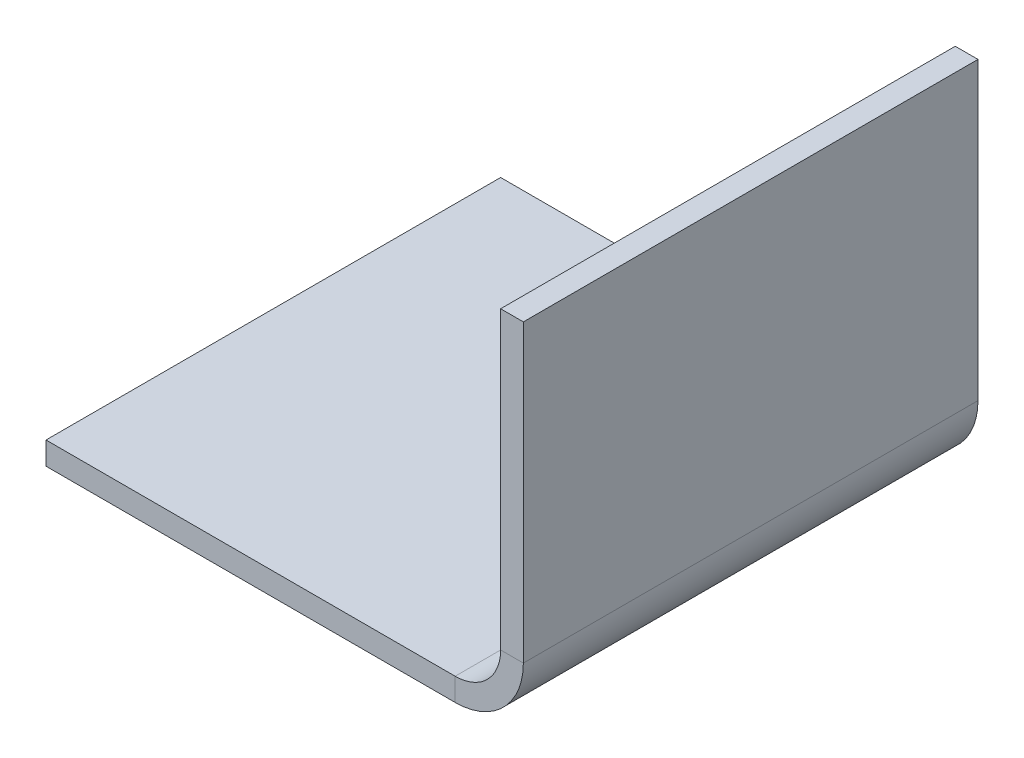
ISO-10303-21;
HEADER;
FILE_DESCRIPTION(('STEP AP214'),'2;1');
FILE_NAME('part.step','',(''),(''),'','','');
FILE_SCHEMA(('AUTOMOTIVE_DESIGN { 1 0 10303 214 1 1 1 1 }'));
ENDSEC;
DATA;
#1=APPLICATION_CONTEXT('core data for automotive mechanical design processes');
#2=APPLICATION_PROTOCOL_DEFINITION('international standard','automotive_design',2000,#1);
#3=PRODUCT_CONTEXT('',#1,'mechanical');
#4=PRODUCT('Part','Part','',(#3));
#5=PRODUCT_RELATED_PRODUCT_CATEGORY('part','',(#4));
#6=PRODUCT_DEFINITION_FORMATION('','',#4);
#7=PRODUCT_DEFINITION_CONTEXT('part definition',#1,'design');
#8=PRODUCT_DEFINITION('design','',#6,#7);
#9=PRODUCT_DEFINITION_SHAPE('','',#8);
#10=(LENGTH_UNIT() NAMED_UNIT(*) SI_UNIT(.MILLI.,.METRE.));
#11=(NAMED_UNIT(*) PLANE_ANGLE_UNIT() SI_UNIT($,.RADIAN.));
#12=(NAMED_UNIT(*) SI_UNIT($,.STERADIAN.) SOLID_ANGLE_UNIT());
#13=UNCERTAINTY_MEASURE_WITH_UNIT(LENGTH_MEASURE(1.E-05),#10,'distance_accuracy_value','');
#14=(GEOMETRIC_REPRESENTATION_CONTEXT(3) GLOBAL_UNCERTAINTY_ASSIGNED_CONTEXT((#13)) GLOBAL_UNIT_ASSIGNED_CONTEXT((#10,
#11,#12)) REPRESENTATION_CONTEXT('',''));
#15=CARTESIAN_POINT('',(0.,0.,0.));
#16=DIRECTION('',(0.,0.,1.));
#17=DIRECTION('',(1.,0.,0.));
#18=AXIS2_PLACEMENT_3D('',#15,#16,#17);
#19=CARTESIAN_POINT('',(20.,2.,20.));
#20=DIRECTION('',(0.,0.,1.));
#21=DIRECTION('',(1.,0.,0.));
#22=AXIS2_PLACEMENT_3D('',#19,#20,#21);
#23=PLANE('',#22);
#24=DIRECTION('',(1.,0.,0.));
#25=VECTOR('',#24,1.);
#26=CARTESIAN_POINT('',(20.,2.,20.));
#27=LINE('',#26,#25);
#28=CARTESIAN_POINT('',(20.,2.,20.));
#29=VERTEX_POINT('',#28);
#30=CARTESIAN_POINT('',(21.,2.,20.));
#31=VERTEX_POINT('',#30);
#32=EDGE_CURVE('E11',#29,#31,#27,.T.);
#33=ORIENTED_EDGE('',*,*,#32,.F.);
#34=CARTESIAN_POINT('',(18.,2.,20.));
#35=DIRECTION('',(0.,0.,-1.));
#36=DIRECTION('',(-1.,0.,0.));
#37=AXIS2_PLACEMENT_3D('',#34,#35,#36);
#38=CIRCLE('',#37,2.);
#39=CARTESIAN_POINT('',(18.,0.,20.));
#40=VERTEX_POINT('',#39);
#41=EDGE_CURVE('E139',#40,#29,#38,.F.);
#42=ORIENTED_EDGE('',*,*,#41,.F.);
#43=DIRECTION('',(0.,1.,0.));
#44=VECTOR('',#43,1.);
#45=CARTESIAN_POINT('',(18.,-1.,20.));
#46=LINE('',#45,#44);
#47=CARTESIAN_POINT('',(18.,-1.,20.));
#48=VERTEX_POINT('',#47);
#49=EDGE_CURVE('E47',#48,#40,#46,.T.);
#50=ORIENTED_EDGE('',*,*,#49,.F.);
#51=CARTESIAN_POINT('',(18.,2.,20.));
#52=DIRECTION('',(0.,0.,1.));
#53=DIRECTION('',(1.,0.,0.));
#54=AXIS2_PLACEMENT_3D('',#51,#52,#53);
#55=CIRCLE('',#54,3.);
#56=EDGE_CURVE('E133',#48,#31,#55,.T.);
#57=ORIENTED_EDGE('',*,*,#56,.T.);
#58=EDGE_LOOP('',(#33,#42,#50,#57));
#59=FACE_BOUND('',#58,.T.);
#60=ADVANCED_FACE('F41',(#59),#23,.T.);
#61=CARTESIAN_POINT('',(18.,-1.,20.));
#62=DIRECTION('',(0.,0.,1.));
#63=DIRECTION('',(1.,0.,0.));
#64=AXIS2_PLACEMENT_3D('',#61,#62,#63);
#65=PLANE('',#64);
#66=DIRECTION('',(0.,1.,0.));
#67=VECTOR('',#66,1.);
#68=CARTESIAN_POINT('',(20.,0.,20.));
#69=LINE('',#68,#67);
#70=CARTESIAN_POINT('',(20.,15.,20.));
#71=VERTEX_POINT('',#70);
#72=EDGE_CURVE('E189',#29,#71,#69,.T.);
#73=ORIENTED_EDGE('',*,*,#72,.F.);
#74=ORIENTED_EDGE('',*,*,#32,.T.);
#75=DIRECTION('',(0.,1.,0.));
#76=VECTOR('',#75,1.);
#77=CARTESIAN_POINT('',(21.,0.,20.));
#78=LINE('',#77,#76);
#79=CARTESIAN_POINT('',(21.,15.,20.));
#80=VERTEX_POINT('',#79);
#81=EDGE_CURVE('E100',#31,#80,#78,.T.);
#82=ORIENTED_EDGE('',*,*,#81,.T.);
#83=DIRECTION('',(1.,0.,0.));
#84=VECTOR('',#83,1.);
#85=CARTESIAN_POINT('',(20.,15.,20.));
#86=LINE('',#85,#84);
#87=EDGE_CURVE('E341',#71,#80,#86,.T.);
#88=ORIENTED_EDGE('',*,*,#87,.F.);
#89=EDGE_LOOP('',(#73,#74,#82,#88));
#90=FACE_BOUND('',#89,.T.);
#91=ADVANCED_FACE('F193',(#90),#65,.T.);
#92=CARTESIAN_POINT('',(18.,0.,0.));
#93=DIRECTION('',(0.,0.,-1.));
#94=DIRECTION('',(-1.,0.,0.));
#95=AXIS2_PLACEMENT_3D('',#92,#93,#94);
#96=PLANE('',#95);
#97=DIRECTION('',(0.,-1.,0.));
#98=VECTOR('',#97,1.);
#99=CARTESIAN_POINT('',(18.,0.,0.));
#100=LINE('',#99,#98);
#101=CARTESIAN_POINT('',(18.,0.,0.));
#102=VERTEX_POINT('',#101);
#103=CARTESIAN_POINT('',(18.,-1.,0.));
#104=VERTEX_POINT('',#103);
#105=EDGE_CURVE('E81',#102,#104,#100,.T.);
#106=ORIENTED_EDGE('',*,*,#105,.F.);
#107=CARTESIAN_POINT('',(18.,2.,0.));
#108=DIRECTION('',(0.,0.,-1.));
#109=DIRECTION('',(-1.,0.,0.));
#110=AXIS2_PLACEMENT_3D('',#107,#108,#109);
#111=CIRCLE('',#110,2.);
#112=CARTESIAN_POINT('',(20.,2.,0.));
#113=VERTEX_POINT('',#112);
#114=EDGE_CURVE('E153',#102,#113,#111,.F.);
#115=ORIENTED_EDGE('',*,*,#114,.T.);
#116=DIRECTION('',(-1.,0.,0.));
#117=VECTOR('',#116,1.);
#118=CARTESIAN_POINT('',(21.,2.,0.));
#119=LINE('',#118,#117);
#120=CARTESIAN_POINT('',(21.,2.,0.));
#121=VERTEX_POINT('',#120);
#122=EDGE_CURVE('E93',#121,#113,#119,.T.);
#123=ORIENTED_EDGE('',*,*,#122,.F.);
#124=CARTESIAN_POINT('',(18.,2.,0.));
#125=DIRECTION('',(0.,0.,1.));
#126=DIRECTION('',(1.,0.,0.));
#127=AXIS2_PLACEMENT_3D('',#124,#125,#126);
#128=CIRCLE('',#127,3.);
#129=EDGE_CURVE('E159',#104,#121,#128,.T.);
#130=ORIENTED_EDGE('',*,*,#129,.F.);
#131=EDGE_LOOP('',(#106,#115,#123,#130));
#132=FACE_BOUND('',#131,.T.);
#133=ADVANCED_FACE('F194',(#132),#96,.T.);
#134=CARTESIAN_POINT('',(21.,2.,0.));
#135=DIRECTION('',(0.,0.,-1.));
#136=DIRECTION('',(-1.,0.,0.));
#137=AXIS2_PLACEMENT_3D('',#134,#135,#136);
#138=PLANE('',#137);
#139=DIRECTION('',(1.,0.,0.));
#140=VECTOR('',#139,1.);
#141=CARTESIAN_POINT('',(0.,0.,0.));
#142=LINE('',#141,#140);
#143=CARTESIAN_POINT('',(0.,0.,0.));
#144=VERTEX_POINT('',#143);
#145=EDGE_CURVE('E154',#144,#102,#142,.T.);
#146=ORIENTED_EDGE('',*,*,#145,.T.);
#147=ORIENTED_EDGE('',*,*,#105,.T.);
#148=DIRECTION('',(1.,0.,0.));
#149=VECTOR('',#148,1.);
#150=CARTESIAN_POINT('',(0.,-1.,0.));
#151=LINE('',#150,#149);
#152=CARTESIAN_POINT('',(0.,-1.,0.));
#153=VERTEX_POINT('',#152);
#154=EDGE_CURVE('E158',#153,#104,#151,.T.);
#155=ORIENTED_EDGE('',*,*,#154,.F.);
#156=DIRECTION('',(0.,1.,0.));
#157=VECTOR('',#156,1.);
#158=CARTESIAN_POINT('',(0.,-1.,0.));
#159=LINE('',#158,#157);
#160=EDGE_CURVE('E120',#153,#144,#159,.T.);
#161=ORIENTED_EDGE('',*,*,#160,.T.);
#162=EDGE_LOOP('',(#146,#147,#155,#161));
#163=FACE_BOUND('',#162,.T.);
#164=ADVANCED_FACE('F190',(#163),#138,.T.);
#165=CARTESIAN_POINT('',(21.,0.,20.));
#166=DIRECTION('',(-1.,0.,0.));
#167=DIRECTION('',(0.,0.,1.));
#168=AXIS2_PLACEMENT_3D('',#165,#166,#167);
#169=PLANE('',#168);
#170=DIRECTION('',(0.,1.,0.));
#171=VECTOR('',#170,1.);
#172=CARTESIAN_POINT('',(21.,0.,0.));
#173=LINE('',#172,#171);
#174=CARTESIAN_POINT('',(21.,15.,0.));
#175=VERTEX_POINT('',#174);
#176=EDGE_CURVE('E145',#121,#175,#173,.T.);
#177=ORIENTED_EDGE('',*,*,#176,.T.);
#178=DIRECTION('',(0.,0.,-1.));
#179=VECTOR('',#178,1.);
#180=CARTESIAN_POINT('',(21.,15.,20.));
#181=LINE('',#180,#179);
#182=EDGE_CURVE('E175',#80,#175,#181,.T.);
#183=ORIENTED_EDGE('',*,*,#182,.F.);
#184=ORIENTED_EDGE('',*,*,#81,.F.);
#185=DIRECTION('',(0.,0.,-1.));
#186=VECTOR('',#185,1.);
#187=CARTESIAN_POINT('',(21.,2.,20.));
#188=LINE('',#187,#186);
#189=EDGE_CURVE('E141',#31,#121,#188,.T.);
#190=ORIENTED_EDGE('',*,*,#189,.T.);
#191=EDGE_LOOP('',(#177,#183,#184,#190));
#192=FACE_BOUND('',#191,.T.);
#193=ADVANCED_FACE('F203',(#192),#169,.F.);
#194=CARTESIAN_POINT('',(20.,15.,20.));
#195=DIRECTION('',(0.,1.,0.));
#196=DIRECTION('',(0.,0.,1.));
#197=AXIS2_PLACEMENT_3D('',#194,#195,#196);
#198=PLANE('',#197);
#199=DIRECTION('',(1.,0.,0.));
#200=VECTOR('',#199,1.);
#201=CARTESIAN_POINT('',(20.,15.,0.));
#202=LINE('',#201,#200);
#203=CARTESIAN_POINT('',(20.,15.,0.));
#204=VERTEX_POINT('',#203);
#205=EDGE_CURVE('E150',#204,#175,#202,.T.);
#206=ORIENTED_EDGE('',*,*,#205,.F.);
#207=DIRECTION('',(0.,0.,-1.));
#208=VECTOR('',#207,1.);
#209=CARTESIAN_POINT('',(20.,15.,20.));
#210=LINE('',#209,#208);
#211=EDGE_CURVE('E174',#71,#204,#210,.T.);
#212=ORIENTED_EDGE('',*,*,#211,.F.);
#213=ORIENTED_EDGE('',*,*,#87,.T.);
#214=ORIENTED_EDGE('',*,*,#182,.T.);
#215=EDGE_LOOP('',(#206,#212,#213,#214));
#216=FACE_BOUND('',#215,.T.);
#217=ADVANCED_FACE('F231',(#216),#198,.T.);
#218=CARTESIAN_POINT('',(20.,0.,20.));
#219=DIRECTION('',(-1.,0.,0.));
#220=DIRECTION('',(0.,0.,1.));
#221=AXIS2_PLACEMENT_3D('',#218,#219,#220);
#222=PLANE('',#221);
#223=DIRECTION('',(0.,1.,0.));
#224=VECTOR('',#223,1.);
#225=CARTESIAN_POINT('',(20.,0.,0.));
#226=LINE('',#225,#224);
#227=EDGE_CURVE('E147',#113,#204,#226,.T.);
#228=ORIENTED_EDGE('',*,*,#227,.F.);
#229=DIRECTION('',(0.,0.,-1.));
#230=VECTOR('',#229,1.);
#231=CARTESIAN_POINT('',(20.,2.,20.));
#232=LINE('',#231,#230);
#233=EDGE_CURVE('E166',#29,#113,#232,.T.);
#234=ORIENTED_EDGE('',*,*,#233,.F.);
#235=ORIENTED_EDGE('',*,*,#72,.T.);
#236=ORIENTED_EDGE('',*,*,#211,.T.);
#237=EDGE_LOOP('',(#228,#234,#235,#236));
#238=FACE_BOUND('',#237,.T.);
#239=ADVANCED_FACE('F241',(#238),#222,.T.);
#240=CARTESIAN_POINT('',(18.,2.,20.));
#241=DIRECTION('',(0.,0.,-1.));
#242=DIRECTION('',(-1.,0.,0.));
#243=AXIS2_PLACEMENT_3D('',#240,#241,#242);
#244=CYLINDRICAL_SURFACE('',#243,2.);
#245=ORIENTED_EDGE('',*,*,#114,.F.);
#246=DIRECTION('',(0.,0.,-1.));
#247=VECTOR('',#246,1.);
#248=CARTESIAN_POINT('',(18.,0.,20.));
#249=LINE('',#248,#247);
#250=EDGE_CURVE('E167',#40,#102,#249,.T.);
#251=ORIENTED_EDGE('',*,*,#250,.F.);
#252=ORIENTED_EDGE('',*,*,#41,.T.);
#253=ORIENTED_EDGE('',*,*,#233,.T.);
#254=EDGE_LOOP('',(#245,#251,#252,#253));
#255=FACE_BOUND('',#254,.T.);
#256=ADVANCED_FACE('F181',(#255),#244,.F.);
#257=CARTESIAN_POINT('',(0.,0.,20.));
#258=DIRECTION('',(0.,1.,0.));
#259=DIRECTION('',(0.,0.,1.));
#260=AXIS2_PLACEMENT_3D('',#257,#258,#259);
#261=PLANE('',#260);
#262=ORIENTED_EDGE('',*,*,#145,.F.);
#263=DIRECTION('',(0.,0.,-1.));
#264=VECTOR('',#263,1.);
#265=CARTESIAN_POINT('',(0.,0.,20.));
#266=LINE('',#265,#264);
#267=CARTESIAN_POINT('',(0.,0.,20.));
#268=VERTEX_POINT('',#267);
#269=EDGE_CURVE('E122',#268,#144,#266,.T.);
#270=ORIENTED_EDGE('',*,*,#269,.F.);
#271=DIRECTION('',(1.,0.,0.));
#272=VECTOR('',#271,1.);
#273=CARTESIAN_POINT('',(0.,0.,20.));
#274=LINE('',#273,#272);
#275=EDGE_CURVE('E137',#268,#40,#274,.T.);
#276=ORIENTED_EDGE('',*,*,#275,.T.);
#277=ORIENTED_EDGE('',*,*,#250,.T.);
#278=EDGE_LOOP('',(#262,#270,#276,#277));
#279=FACE_BOUND('',#278,.T.);
#280=ADVANCED_FACE('F187',(#279),#261,.T.);
#281=CARTESIAN_POINT('',(0.,-1.,20.));
#282=DIRECTION('',(-1.,0.,0.));
#283=DIRECTION('',(0.,0.,1.));
#284=AXIS2_PLACEMENT_3D('',#281,#282,#283);
#285=PLANE('',#284);
#286=ORIENTED_EDGE('',*,*,#160,.F.);
#287=DIRECTION('',(0.,0.,-1.));
#288=VECTOR('',#287,1.);
#289=CARTESIAN_POINT('',(0.,-1.,20.));
#290=LINE('',#289,#288);
#291=CARTESIAN_POINT('',(0.,-1.,20.));
#292=VERTEX_POINT('',#291);
#293=EDGE_CURVE('E114',#292,#153,#290,.T.);
#294=ORIENTED_EDGE('',*,*,#293,.F.);
#295=DIRECTION('',(0.,1.,0.));
#296=VECTOR('',#295,1.);
#297=CARTESIAN_POINT('',(0.,-1.,20.));
#298=LINE('',#297,#296);
#299=EDGE_CURVE('E119',#292,#268,#298,.T.);
#300=ORIENTED_EDGE('',*,*,#299,.T.);
#301=ORIENTED_EDGE('',*,*,#269,.T.);
#302=EDGE_LOOP('',(#286,#294,#300,#301));
#303=FACE_BOUND('',#302,.T.);
#304=ADVANCED_FACE('F113',(#303),#285,.T.);
#305=CARTESIAN_POINT('',(0.,-1.,20.));
#306=DIRECTION('',(0.,1.,0.));
#307=DIRECTION('',(0.,0.,1.));
#308=AXIS2_PLACEMENT_3D('',#305,#306,#307);
#309=PLANE('',#308);
#310=ORIENTED_EDGE('',*,*,#154,.T.);
#311=DIRECTION('',(0.,0.,-1.));
#312=VECTOR('',#311,1.);
#313=CARTESIAN_POINT('',(18.,-1.,20.));
#314=LINE('',#313,#312);
#315=EDGE_CURVE('E125',#48,#104,#314,.T.);
#316=ORIENTED_EDGE('',*,*,#315,.F.);
#317=DIRECTION('',(1.,0.,0.));
#318=VECTOR('',#317,1.);
#319=CARTESIAN_POINT('',(0.,-1.,20.));
#320=LINE('',#319,#318);
#321=EDGE_CURVE('E127',#292,#48,#320,.T.);
#322=ORIENTED_EDGE('',*,*,#321,.F.);
#323=ORIENTED_EDGE('',*,*,#293,.T.);
#324=EDGE_LOOP('',(#310,#316,#322,#323));
#325=FACE_BOUND('',#324,.T.);
#326=ADVANCED_FACE('F130',(#325),#309,.F.);
#327=CARTESIAN_POINT('',(18.,2.,20.));
#328=DIRECTION('',(0.,0.,-1.));
#329=DIRECTION('',(-1.,0.,0.));
#330=AXIS2_PLACEMENT_3D('',#327,#328,#329);
#331=CYLINDRICAL_SURFACE('',#330,3.);
#332=ORIENTED_EDGE('',*,*,#129,.T.);
#333=ORIENTED_EDGE('',*,*,#189,.F.);
#334=ORIENTED_EDGE('',*,*,#56,.F.);
#335=ORIENTED_EDGE('',*,*,#315,.T.);
#336=EDGE_LOOP('',(#332,#333,#334,#335));
#337=FACE_BOUND('',#336,.T.);
#338=ADVANCED_FACE('F192',(#337),#331,.T.);
#339=CARTESIAN_POINT('',(18.,2.,20.));
#340=DIRECTION('',(0.,0.,-1.));
#341=DIRECTION('',(-1.,0.,0.));
#342=AXIS2_PLACEMENT_3D('',#339,#340,#341);
#343=PLANE('',#342);
#344=ORIENTED_EDGE('',*,*,#321,.T.);
#345=ORIENTED_EDGE('',*,*,#49,.T.);
#346=ORIENTED_EDGE('',*,*,#275,.F.);
#347=ORIENTED_EDGE('',*,*,#299,.F.);
#348=EDGE_LOOP('',(#344,#345,#346,#347));
#349=FACE_BOUND('',#348,.T.);
#350=ADVANCED_FACE('F135',(#349),#343,.F.);
#351=CARTESIAN_POINT('',(18.,2.,0.));
#352=DIRECTION('',(0.,0.,-1.));
#353=DIRECTION('',(-1.,0.,0.));
#354=AXIS2_PLACEMENT_3D('',#351,#352,#353);
#355=PLANE('',#354);
#356=ORIENTED_EDGE('',*,*,#176,.F.);
#357=ORIENTED_EDGE('',*,*,#122,.T.);
#358=ORIENTED_EDGE('',*,*,#227,.T.);
#359=ORIENTED_EDGE('',*,*,#205,.T.);
#360=EDGE_LOOP('',(#356,#357,#358,#359));
#361=FACE_BOUND('',#360,.T.);
#362=ADVANCED_FACE('F313',(#361),#355,.T.);
#363=CLOSED_SHELL('',(#60,#91,#133,#164,#193,#217,#239,#256,#280,#304,#326,#338,#350,#362));
#364=MANIFOLD_SOLID_BREP('B2',#363);
#365=ADVANCED_BREP_SHAPE_REPRESENTATION('',(#18,#364),#14);
#366=SHAPE_DEFINITION_REPRESENTATION(#9,#365);
ENDSEC;
END-ISO-10303-21;
